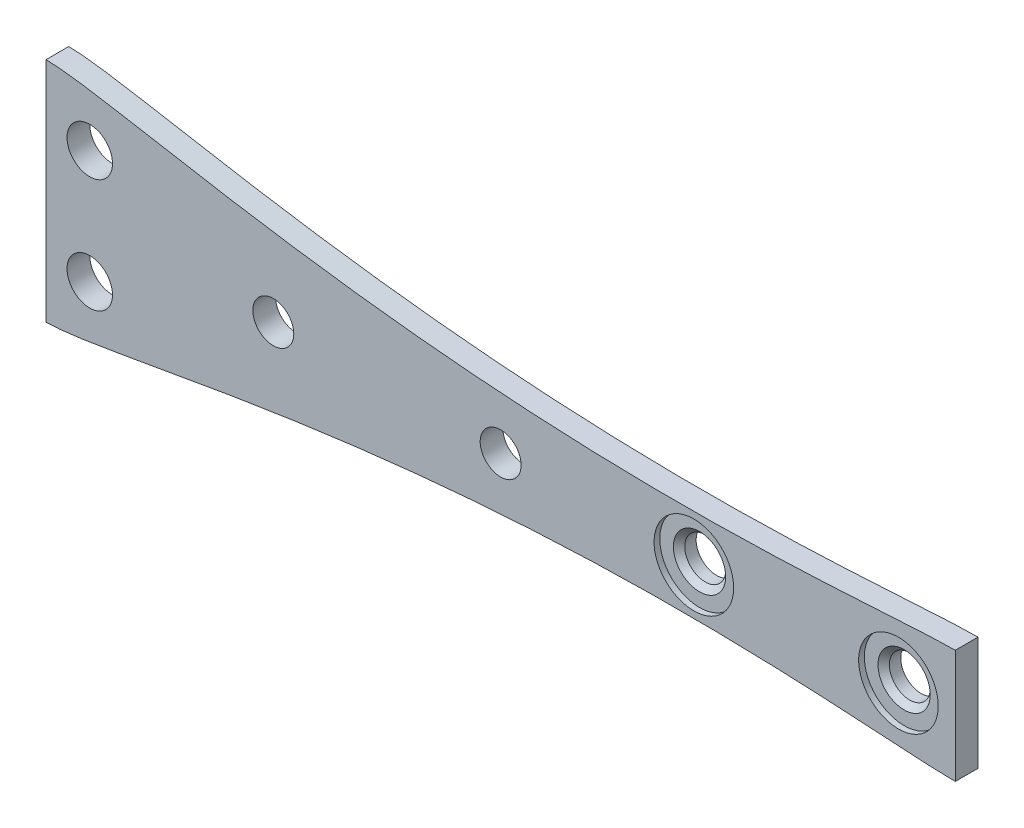
ISO-10303-21;
HEADER;
FILE_DESCRIPTION(('STEP AP214'),'2;1');
FILE_NAME('part.step','',(''),(''),'','','');
FILE_SCHEMA(('AUTOMOTIVE_DESIGN { 1 0 10303 214 1 1 1 1 }'));
ENDSEC;
DATA;
#1=APPLICATION_CONTEXT('core data for automotive mechanical design processes');
#2=APPLICATION_PROTOCOL_DEFINITION('international standard','automotive_design',2000,#1);
#3=PRODUCT_CONTEXT('',#1,'mechanical');
#4=PRODUCT('Part','Part','',(#3));
#5=PRODUCT_RELATED_PRODUCT_CATEGORY('part','',(#4));
#6=PRODUCT_DEFINITION_FORMATION('','',#4);
#7=PRODUCT_DEFINITION_CONTEXT('part definition',#1,'design');
#8=PRODUCT_DEFINITION('design','',#6,#7);
#9=PRODUCT_DEFINITION_SHAPE('','',#8);
#10=(LENGTH_UNIT() NAMED_UNIT(*) SI_UNIT(.MILLI.,.METRE.));
#11=(NAMED_UNIT(*) PLANE_ANGLE_UNIT() SI_UNIT($,.RADIAN.));
#12=(NAMED_UNIT(*) SI_UNIT($,.STERADIAN.) SOLID_ANGLE_UNIT());
#13=UNCERTAINTY_MEASURE_WITH_UNIT(LENGTH_MEASURE(1.E-05),#10,'distance_accuracy_value','');
#14=(GEOMETRIC_REPRESENTATION_CONTEXT(3) GLOBAL_UNCERTAINTY_ASSIGNED_CONTEXT((#13)) GLOBAL_UNIT_ASSIGNED_CONTEXT((#10,
#11,#12)) REPRESENTATION_CONTEXT('',''));
#15=CARTESIAN_POINT('',(0.,0.,0.));
#16=DIRECTION('',(0.,0.,1.));
#17=DIRECTION('',(1.,0.,0.));
#18=AXIS2_PLACEMENT_3D('',#15,#16,#17);
#19=CARTESIAN_POINT('',(57.,10.,2.));
#20=DIRECTION('',(0.,0.,-1.));
#21=DIRECTION('',(-1.,0.,0.));
#22=AXIS2_PLACEMENT_3D('',#19,#20,#21);
#23=CYLINDRICAL_SURFACE('',#22,1.8);
#24=CARTESIAN_POINT('',(57.,10.,0.999999999999977));
#25=DIRECTION('',(0.,0.,1.));
#26=DIRECTION('',(1.,0.,0.));
#27=AXIS2_PLACEMENT_3D('',#24,#25,#26);
#28=CIRCLE('',#27,1.8);
#29=CARTESIAN_POINT('',(58.8,10.,0.999999999999977));
#30=VERTEX_POINT('',#29);
#31=EDGE_CURVE('E58',#30,#30,#28,.T.);
#32=ORIENTED_EDGE('',*,*,#31,.T.);
#33=EDGE_LOOP('',(#32));
#34=FACE_BOUND('',#33,.T.);
#35=CARTESIAN_POINT('',(57.,10.,0.));
#36=DIRECTION('',(0.,0.,1.));
#37=DIRECTION('',(1.,0.,0.));
#38=AXIS2_PLACEMENT_3D('',#35,#36,#37);
#39=CIRCLE('',#38,1.8);
#40=CARTESIAN_POINT('',(58.8,10.,0.));
#41=VERTEX_POINT('',#40);
#42=EDGE_CURVE('E215',#41,#41,#39,.T.);
#43=ORIENTED_EDGE('',*,*,#42,.F.);
#44=EDGE_LOOP('',(#43));
#45=FACE_BOUND('',#44,.T.);
#46=ADVANCED_FACE('F47',(#34,#45),#23,.F.);
#47=CARTESIAN_POINT('',(75.,10.,2.));
#48=DIRECTION('',(0.,0.,-1.));
#49=DIRECTION('',(-1.,0.,0.));
#50=AXIS2_PLACEMENT_3D('',#47,#48,#49);
#51=CYLINDRICAL_SURFACE('',#50,1.79999999999999);
#52=CARTESIAN_POINT('',(75.,10.,0.999999999999998));
#53=DIRECTION('',(0.,0.,1.));
#54=DIRECTION('',(1.,0.,0.));
#55=AXIS2_PLACEMENT_3D('',#52,#53,#54);
#56=CIRCLE('',#55,1.79999999999999);
#57=CARTESIAN_POINT('',(76.8,10.,0.999999999999998));
#58=VERTEX_POINT('',#57);
#59=EDGE_CURVE('E230',#58,#58,#56,.T.);
#60=ORIENTED_EDGE('',*,*,#59,.T.);
#61=EDGE_LOOP('',(#60));
#62=FACE_BOUND('',#61,.T.);
#63=CARTESIAN_POINT('',(75.,10.,0.));
#64=DIRECTION('',(0.,0.,1.));
#65=DIRECTION('',(1.,0.,0.));
#66=AXIS2_PLACEMENT_3D('',#63,#64,#65);
#67=CIRCLE('',#66,1.79999999999999);
#68=CARTESIAN_POINT('',(76.8,10.,0.));
#69=VERTEX_POINT('',#68);
#70=EDGE_CURVE('E219',#69,#69,#67,.T.);
#71=ORIENTED_EDGE('',*,*,#70,.F.);
#72=EDGE_LOOP('',(#71));
#73=FACE_BOUND('',#72,.T.);
#74=ADVANCED_FACE('F147',(#62,#73),#51,.F.);
#75=CARTESIAN_POINT('',(80.,0.,2.));
#76=DIRECTION('',(1.,0.,0.));
#77=DIRECTION('',(0.,0.,-1.));
#78=AXIS2_PLACEMENT_3D('',#75,#76,#77);
#79=PLANE('',#78);
#80=DIRECTION('',(0.,-1.,0.));
#81=VECTOR('',#80,1.);
#82=CARTESIAN_POINT('',(80.,0.,0.));
#83=LINE('',#82,#81);
#84=CARTESIAN_POINT('',(80.,15.,0.));
#85=VERTEX_POINT('',#84);
#86=CARTESIAN_POINT('',(80.,5.00000000000001,0.));
#87=VERTEX_POINT('',#86);
#88=EDGE_CURVE('E300',#85,#87,#83,.T.);
#89=ORIENTED_EDGE('',*,*,#88,.F.);
#90=DIRECTION('',(0.,0.,-1.));
#91=VECTOR('',#90,1.);
#92=CARTESIAN_POINT('',(80.,15.,2.));
#93=LINE('',#92,#91);
#94=CARTESIAN_POINT('',(80.,15.,2.));
#95=VERTEX_POINT('',#94);
#96=EDGE_CURVE('E92',#95,#85,#93,.T.);
#97=ORIENTED_EDGE('',*,*,#96,.F.);
#98=DIRECTION('',(0.,-1.,0.));
#99=VECTOR('',#98,1.);
#100=CARTESIAN_POINT('',(80.,0.,2.));
#101=LINE('',#100,#99);
#102=CARTESIAN_POINT('',(80.,5.00000000000001,2.));
#103=VERTEX_POINT('',#102);
#104=EDGE_CURVE('E112',#95,#103,#101,.T.);
#105=ORIENTED_EDGE('',*,*,#104,.T.);
#106=DIRECTION('',(0.,0.,-1.));
#107=VECTOR('',#106,1.);
#108=CARTESIAN_POINT('',(80.,5.00000000000001,2.));
#109=LINE('',#108,#107);
#110=EDGE_CURVE('E89',#103,#87,#109,.T.);
#111=ORIENTED_EDGE('',*,*,#110,.T.);
#112=EDGE_LOOP('',(#89,#97,#105,#111));
#113=FACE_BOUND('',#112,.T.);
#114=ADVANCED_FACE('F145',(#113),#79,.T.);
#115=CARTESIAN_POINT('',(0.,20.,2.));
#116=CARTESIAN_POINT('',(8.,20.,2.));
#117=CARTESIAN_POINT('',(39.,10.,2.));
#118=CARTESIAN_POINT('',(70.,15.,2.));
#119=CARTESIAN_POINT('',(80.,15.,2.));
#120=B_SPLINE_CURVE_WITH_KNOTS('',4,(#115,#116,#117,#118,#119),.UNSPECIFIED.,.F.,.F.,(5,5),(0.,
1.),.UNSPECIFIED.);
#121=DIRECTION('',(0.,0.,-1.));
#122=VECTOR('',#121,1.);
#123=SURFACE_OF_LINEAR_EXTRUSION('',#120,#122);
#124=CARTESIAN_POINT('',(0.,20.,0.));
#125=CARTESIAN_POINT('',(8.,20.,0.));
#126=CARTESIAN_POINT('',(39.,10.,0.));
#127=CARTESIAN_POINT('',(70.,15.,0.));
#128=CARTESIAN_POINT('',(80.,15.,0.));
#129=B_SPLINE_CURVE_WITH_KNOTS('',4,(#124,#125,#126,#127,#128),.UNSPECIFIED.,.F.,.F.,(5,5),(0.,
1.),.UNSPECIFIED.);
#130=CARTESIAN_POINT('',(0.,20.,0.));
#131=VERTEX_POINT('',#130);
#132=EDGE_CURVE('E102',#131,#85,#129,.T.);
#133=ORIENTED_EDGE('',*,*,#132,.F.);
#134=DIRECTION('',(0.,0.,-1.));
#135=VECTOR('',#134,1.);
#136=CARTESIAN_POINT('',(0.,20.,2.));
#137=LINE('',#136,#135);
#138=CARTESIAN_POINT('',(0.,20.,2.));
#139=VERTEX_POINT('',#138);
#140=EDGE_CURVE('E97',#139,#131,#137,.T.);
#141=ORIENTED_EDGE('',*,*,#140,.F.);
#142=EDGE_CURVE('E100',#139,#95,#120,.T.);
#143=ORIENTED_EDGE('',*,*,#142,.T.);
#144=ORIENTED_EDGE('',*,*,#96,.T.);
#145=EDGE_LOOP('',(#133,#141,#143,#144));
#146=FACE_BOUND('',#145,.T.);
#147=ADVANCED_FACE('F99',(#146),#123,.T.);
#148=CARTESIAN_POINT('',(0.,0.,2.));
#149=DIRECTION('',(-1.,0.,0.));
#150=DIRECTION('',(0.,0.,1.));
#151=AXIS2_PLACEMENT_3D('',#148,#149,#150);
#152=PLANE('',#151);
#153=DIRECTION('',(0.,1.,0.));
#154=VECTOR('',#153,1.);
#155=CARTESIAN_POINT('',(0.,0.,0.));
#156=LINE('',#155,#154);
#157=CARTESIAN_POINT('',(0.,0.,0.));
#158=VERTEX_POINT('',#157);
#159=EDGE_CURVE('E311',#158,#131,#156,.T.);
#160=ORIENTED_EDGE('',*,*,#159,.F.);
#161=DIRECTION('',(0.,0.,-1.));
#162=VECTOR('',#161,1.);
#163=CARTESIAN_POINT('',(0.,0.,2.));
#164=LINE('',#163,#162);
#165=CARTESIAN_POINT('',(0.,0.,2.));
#166=VERTEX_POINT('',#165);
#167=EDGE_CURVE('E82',#166,#158,#164,.T.);
#168=ORIENTED_EDGE('',*,*,#167,.F.);
#169=DIRECTION('',(0.,1.,0.));
#170=VECTOR('',#169,1.);
#171=CARTESIAN_POINT('',(0.,0.,2.));
#172=LINE('',#171,#170);
#173=EDGE_CURVE('E111',#166,#139,#172,.T.);
#174=ORIENTED_EDGE('',*,*,#173,.T.);
#175=ORIENTED_EDGE('',*,*,#140,.T.);
#176=EDGE_LOOP('',(#160,#168,#174,#175));
#177=FACE_BOUND('',#176,.T.);
#178=ADVANCED_FACE('F115',(#177),#152,.T.);
#179=CARTESIAN_POINT('',(20.,10.,2.));
#180=DIRECTION('',(0.,0.,-1.));
#181=DIRECTION('',(-1.,0.,0.));
#182=AXIS2_PLACEMENT_3D('',#179,#180,#181);
#183=CYLINDRICAL_SURFACE('',#182,1.8);
#184=CARTESIAN_POINT('',(20.,10.,2.));
#185=DIRECTION('',(0.,0.,1.));
#186=DIRECTION('',(1.,0.,0.));
#187=AXIS2_PLACEMENT_3D('',#184,#185,#186);
#188=CIRCLE('',#187,1.8);
#189=CARTESIAN_POINT('',(21.8,10.,2.));
#190=VERTEX_POINT('',#189);
#191=EDGE_CURVE('E225',#190,#190,#188,.T.);
#192=ORIENTED_EDGE('',*,*,#191,.T.);
#193=EDGE_LOOP('',(#192));
#194=FACE_BOUND('',#193,.T.);
#195=CARTESIAN_POINT('',(20.,10.,0.));
#196=DIRECTION('',(0.,0.,1.));
#197=DIRECTION('',(1.,0.,0.));
#198=AXIS2_PLACEMENT_3D('',#195,#196,#197);
#199=CIRCLE('',#198,1.8);
#200=CARTESIAN_POINT('',(21.8,10.,0.));
#201=VERTEX_POINT('',#200);
#202=EDGE_CURVE('E205',#201,#201,#199,.T.);
#203=ORIENTED_EDGE('',*,*,#202,.F.);
#204=EDGE_LOOP('',(#203));
#205=FACE_BOUND('',#204,.T.);
#206=ADVANCED_FACE('F142',(#194,#205),#183,.F.);
#207=CARTESIAN_POINT('',(40.,9.99999999999998,2.));
#208=DIRECTION('',(0.,0.,-1.));
#209=DIRECTION('',(-1.,0.,0.));
#210=AXIS2_PLACEMENT_3D('',#207,#208,#209);
#211=CYLINDRICAL_SURFACE('',#210,1.8);
#212=CARTESIAN_POINT('',(40.,9.99999999999998,2.));
#213=DIRECTION('',(0.,0.,1.));
#214=DIRECTION('',(1.,0.,0.));
#215=AXIS2_PLACEMENT_3D('',#212,#213,#214);
#216=CIRCLE('',#215,1.8);
#217=CARTESIAN_POINT('',(41.8,9.99999999999998,2.));
#218=VERTEX_POINT('',#217);
#219=EDGE_CURVE('E243',#218,#218,#216,.T.);
#220=ORIENTED_EDGE('',*,*,#219,.T.);
#221=EDGE_LOOP('',(#220));
#222=FACE_BOUND('',#221,.T.);
#223=CARTESIAN_POINT('',(40.,9.99999999999998,0.));
#224=DIRECTION('',(0.,0.,1.));
#225=DIRECTION('',(1.,0.,0.));
#226=AXIS2_PLACEMENT_3D('',#223,#224,#225);
#227=CIRCLE('',#226,1.8);
#228=CARTESIAN_POINT('',(41.8,9.99999999999998,0.));
#229=VERTEX_POINT('',#228);
#230=EDGE_CURVE('E199',#229,#229,#227,.T.);
#231=ORIENTED_EDGE('',*,*,#230,.F.);
#232=EDGE_LOOP('',(#231));
#233=FACE_BOUND('',#232,.T.);
#234=ADVANCED_FACE('F179',(#222,#233),#211,.F.);
#235=CARTESIAN_POINT('',(3.85,15.,2.));
#236=DIRECTION('',(0.,0.,-1.));
#237=DIRECTION('',(-1.,0.,0.));
#238=AXIS2_PLACEMENT_3D('',#235,#236,#237);
#239=CYLINDRICAL_SURFACE('',#238,2.);
#240=CARTESIAN_POINT('',(3.85,15.,2.));
#241=DIRECTION('',(0.,0.,1.));
#242=DIRECTION('',(1.,0.,0.));
#243=AXIS2_PLACEMENT_3D('',#240,#241,#242);
#244=CIRCLE('',#243,2.);
#245=CARTESIAN_POINT('',(5.85,15.,2.));
#246=VERTEX_POINT('',#245);
#247=EDGE_CURVE('E193',#246,#246,#244,.T.);
#248=ORIENTED_EDGE('',*,*,#247,.T.);
#249=EDGE_LOOP('',(#248));
#250=FACE_BOUND('',#249,.T.);
#251=CARTESIAN_POINT('',(3.85,15.,0.));
#252=DIRECTION('',(0.,0.,1.));
#253=DIRECTION('',(1.,0.,0.));
#254=AXIS2_PLACEMENT_3D('',#251,#252,#253);
#255=CIRCLE('',#254,2.);
#256=CARTESIAN_POINT('',(5.85,15.,0.));
#257=VERTEX_POINT('',#256);
#258=EDGE_CURVE('E196',#257,#257,#255,.T.);
#259=ORIENTED_EDGE('',*,*,#258,.F.);
#260=EDGE_LOOP('',(#259));
#261=FACE_BOUND('',#260,.T.);
#262=ADVANCED_FACE('F182',(#250,#261),#239,.F.);
#263=CARTESIAN_POINT('',(3.85,5.,2.));
#264=DIRECTION('',(0.,0.,-1.));
#265=DIRECTION('',(-1.,0.,0.));
#266=AXIS2_PLACEMENT_3D('',#263,#264,#265);
#267=CYLINDRICAL_SURFACE('',#266,2.);
#268=CARTESIAN_POINT('',(3.85,5.,2.));
#269=DIRECTION('',(0.,0.,1.));
#270=DIRECTION('',(1.,0.,0.));
#271=AXIS2_PLACEMENT_3D('',#268,#269,#270);
#272=CIRCLE('',#271,2.);
#273=CARTESIAN_POINT('',(5.85,5.,2.));
#274=VERTEX_POINT('',#273);
#275=EDGE_CURVE('E119',#274,#274,#272,.T.);
#276=ORIENTED_EDGE('',*,*,#275,.T.);
#277=EDGE_LOOP('',(#276));
#278=FACE_BOUND('',#277,.T.);
#279=CARTESIAN_POINT('',(3.85,5.,0.));
#280=DIRECTION('',(0.,0.,1.));
#281=DIRECTION('',(1.,0.,0.));
#282=AXIS2_PLACEMENT_3D('',#279,#280,#281);
#283=CIRCLE('',#282,2.);
#284=CARTESIAN_POINT('',(5.85,5.,0.));
#285=VERTEX_POINT('',#284);
#286=EDGE_CURVE('E200',#285,#285,#283,.T.);
#287=ORIENTED_EDGE('',*,*,#286,.F.);
#288=EDGE_LOOP('',(#287));
#289=FACE_BOUND('',#288,.T.);
#290=ADVANCED_FACE('F138',(#278,#289),#267,.F.);
#291=CARTESIAN_POINT('',(0.,0.,2.));
#292=CARTESIAN_POINT('',(8.00000000000001,0.,2.));
#293=CARTESIAN_POINT('',(39.,10.,2.));
#294=CARTESIAN_POINT('',(70.,5.00000000000001,2.));
#295=CARTESIAN_POINT('',(80.,5.00000000000001,2.));
#296=B_SPLINE_CURVE_WITH_KNOTS('',4,(#291,#292,#293,#294,#295),.UNSPECIFIED.,.F.,.F.,(5,5),(0.,
1.),.UNSPECIFIED.);
#297=DIRECTION('',(0.,0.,-1.));
#298=VECTOR('',#297,1.);
#299=SURFACE_OF_LINEAR_EXTRUSION('',#296,#298);
#300=CARTESIAN_POINT('',(0.,0.,0.));
#301=CARTESIAN_POINT('',(8.00000000000001,0.,0.));
#302=CARTESIAN_POINT('',(39.,10.,0.));
#303=CARTESIAN_POINT('',(70.,5.00000000000001,0.));
#304=CARTESIAN_POINT('',(80.,5.00000000000001,0.));
#305=B_SPLINE_CURVE_WITH_KNOTS('',4,(#300,#301,#302,#303,#304),.UNSPECIFIED.,.F.,.F.,(5,5),(0.,
1.),.UNSPECIFIED.);
#306=EDGE_CURVE('E208',#158,#87,#305,.T.);
#307=ORIENTED_EDGE('',*,*,#306,.T.);
#308=ORIENTED_EDGE('',*,*,#110,.F.);
#309=EDGE_CURVE('E66',#166,#103,#296,.T.);
#310=ORIENTED_EDGE('',*,*,#309,.F.);
#311=ORIENTED_EDGE('',*,*,#167,.T.);
#312=EDGE_LOOP('',(#307,#308,#310,#311));
#313=FACE_BOUND('',#312,.T.);
#314=ADVANCED_FACE('F134',(#313),#299,.F.);
#315=CARTESIAN_POINT('',(0.,0.,2.));
#316=DIRECTION('',(0.,0.,1.));
#317=DIRECTION('',(1.,0.,0.));
#318=AXIS2_PLACEMENT_3D('',#315,#316,#317);
#319=PLANE('',#318);
#320=CARTESIAN_POINT('',(57.,10.,2.));
#321=DIRECTION('',(0.,0.,1.));
#322=DIRECTION('',(1.,0.,0.));
#323=AXIS2_PLACEMENT_3D('',#320,#321,#322);
#324=CIRCLE('',#323,3.5);
#325=CARTESIAN_POINT('',(60.5,10.,2.));
#326=VERTEX_POINT('',#325);
#327=EDGE_CURVE('E294',#326,#326,#324,.T.);
#328=ORIENTED_EDGE('',*,*,#327,.F.);
#329=EDGE_LOOP('',(#328));
#330=FACE_BOUND('',#329,.T.);
#331=CARTESIAN_POINT('',(75.,10.,2.));
#332=DIRECTION('',(0.,0.,1.));
#333=DIRECTION('',(1.,0.,0.));
#334=AXIS2_PLACEMENT_3D('',#331,#332,#333);
#335=CIRCLE('',#334,3.50000000000001);
#336=CARTESIAN_POINT('',(78.5,10.,2.));
#337=VERTEX_POINT('',#336);
#338=EDGE_CURVE('E296',#337,#337,#335,.T.);
#339=ORIENTED_EDGE('',*,*,#338,.F.);
#340=EDGE_LOOP('',(#339));
#341=FACE_BOUND('',#340,.T.);
#342=ORIENTED_EDGE('',*,*,#104,.F.);
#343=ORIENTED_EDGE('',*,*,#142,.F.);
#344=ORIENTED_EDGE('',*,*,#173,.F.);
#345=ORIENTED_EDGE('',*,*,#309,.T.);
#346=EDGE_LOOP('',(#342,#343,#344,#345));
#347=FACE_BOUND('',#346,.T.);
#348=ORIENTED_EDGE('',*,*,#275,.F.);
#349=EDGE_LOOP('',(#348));
#350=FACE_BOUND('',#349,.T.);
#351=ORIENTED_EDGE('',*,*,#247,.F.);
#352=EDGE_LOOP('',(#351));
#353=FACE_BOUND('',#352,.T.);
#354=ORIENTED_EDGE('',*,*,#219,.F.);
#355=EDGE_LOOP('',(#354));
#356=FACE_BOUND('',#355,.T.);
#357=ORIENTED_EDGE('',*,*,#191,.F.);
#358=EDGE_LOOP('',(#357));
#359=FACE_BOUND('',#358,.T.);
#360=ADVANCED_FACE('F109',(#330,#341,#347,#350,#353,#356,#359),#319,.T.);
#361=CARTESIAN_POINT('',(0.,0.,0.));
#362=DIRECTION('',(0.,0.,1.));
#363=DIRECTION('',(1.,0.,0.));
#364=AXIS2_PLACEMENT_3D('',#361,#362,#363);
#365=PLANE('',#364);
#366=ORIENTED_EDGE('',*,*,#88,.T.);
#367=ORIENTED_EDGE('',*,*,#306,.F.);
#368=ORIENTED_EDGE('',*,*,#159,.T.);
#369=ORIENTED_EDGE('',*,*,#132,.T.);
#370=EDGE_LOOP('',(#366,#367,#368,#369));
#371=FACE_BOUND('',#370,.T.);
#372=ORIENTED_EDGE('',*,*,#286,.T.);
#373=EDGE_LOOP('',(#372));
#374=FACE_BOUND('',#373,.T.);
#375=ORIENTED_EDGE('',*,*,#258,.T.);
#376=EDGE_LOOP('',(#375));
#377=FACE_BOUND('',#376,.T.);
#378=ORIENTED_EDGE('',*,*,#230,.T.);
#379=EDGE_LOOP('',(#378));
#380=FACE_BOUND('',#379,.T.);
#381=ORIENTED_EDGE('',*,*,#202,.T.);
#382=EDGE_LOOP('',(#381));
#383=FACE_BOUND('',#382,.T.);
#384=ORIENTED_EDGE('',*,*,#42,.T.);
#385=EDGE_LOOP('',(#384));
#386=FACE_BOUND('',#385,.T.);
#387=ORIENTED_EDGE('',*,*,#70,.T.);
#388=EDGE_LOOP('',(#387));
#389=FACE_BOUND('',#388,.T.);
#390=ADVANCED_FACE('F254',(#371,#374,#377,#380,#383,#386,#389),#365,.F.);
#391=CARTESIAN_POINT('',(75.,10.,1.5));
#392=DIRECTION('',(0.,0.,1.));
#393=DIRECTION('',(1.,0.,0.));
#394=AXIS2_PLACEMENT_3D('',#391,#392,#393);
#395=CYLINDRICAL_SURFACE('',#394,3.50000000000001);
#396=CARTESIAN_POINT('',(75.,10.,1.5));
#397=DIRECTION('',(0.,0.,1.));
#398=DIRECTION('',(1.,0.,0.));
#399=AXIS2_PLACEMENT_3D('',#396,#397,#398);
#400=CIRCLE('',#399,3.50000000000001);
#401=CARTESIAN_POINT('',(78.5,10.,1.5));
#402=VERTEX_POINT('',#401);
#403=EDGE_CURVE('E303',#402,#402,#400,.T.);
#404=ORIENTED_EDGE('',*,*,#403,.F.);
#405=EDGE_LOOP('',(#404));
#406=FACE_BOUND('',#405,.T.);
#407=ORIENTED_EDGE('',*,*,#338,.T.);
#408=EDGE_LOOP('',(#407));
#409=FACE_BOUND('',#408,.T.);
#410=ADVANCED_FACE('F266',(#406,#409),#395,.F.);
#411=CARTESIAN_POINT('',(75.,10.,1.5));
#412=DIRECTION('',(0.,0.,1.));
#413=DIRECTION('',(1.,0.,0.));
#414=AXIS2_PLACEMENT_3D('',#411,#412,#413);
#415=PLANE('',#414);
#416=CARTESIAN_POINT('',(75.,10.,1.5));
#417=DIRECTION('',(0.,0.,1.));
#418=DIRECTION('',(1.,0.,0.));
#419=AXIS2_PLACEMENT_3D('',#416,#417,#418);
#420=CIRCLE('',#419,2.3);
#421=CARTESIAN_POINT('',(77.3,10.,1.5));
#422=VERTEX_POINT('',#421);
#423=EDGE_CURVE('E234',#422,#422,#420,.F.);
#424=ORIENTED_EDGE('',*,*,#423,.T.);
#425=EDGE_LOOP('',(#424));
#426=FACE_BOUND('',#425,.T.);
#427=ORIENTED_EDGE('',*,*,#403,.T.);
#428=EDGE_LOOP('',(#427));
#429=FACE_BOUND('',#428,.T.);
#430=ADVANCED_FACE('F275',(#426,#429),#415,.T.);
#431=CARTESIAN_POINT('',(57.,10.,1.5));
#432=DIRECTION('',(0.,0.,1.));
#433=DIRECTION('',(1.,0.,0.));
#434=AXIS2_PLACEMENT_3D('',#431,#432,#433);
#435=CYLINDRICAL_SURFACE('',#434,3.5);
#436=CARTESIAN_POINT('',(57.,10.,1.5));
#437=DIRECTION('',(0.,0.,1.));
#438=DIRECTION('',(1.,0.,0.));
#439=AXIS2_PLACEMENT_3D('',#436,#437,#438);
#440=CIRCLE('',#439,3.5);
#441=CARTESIAN_POINT('',(60.5,10.,1.5));
#442=VERTEX_POINT('',#441);
#443=EDGE_CURVE('E291',#442,#442,#440,.T.);
#444=ORIENTED_EDGE('',*,*,#443,.F.);
#445=EDGE_LOOP('',(#444));
#446=FACE_BOUND('',#445,.T.);
#447=ORIENTED_EDGE('',*,*,#327,.T.);
#448=EDGE_LOOP('',(#447));
#449=FACE_BOUND('',#448,.T.);
#450=ADVANCED_FACE('F160',(#446,#449),#435,.F.);
#451=CARTESIAN_POINT('',(57.,10.,1.5));
#452=DIRECTION('',(0.,0.,1.));
#453=DIRECTION('',(1.,0.,0.));
#454=AXIS2_PLACEMENT_3D('',#451,#452,#453);
#455=PLANE('',#454);
#456=CARTESIAN_POINT('',(57.,10.,1.5));
#457=DIRECTION('',(0.,0.,1.));
#458=DIRECTION('',(1.,0.,0.));
#459=AXIS2_PLACEMENT_3D('',#456,#457,#458);
#460=CIRCLE('',#459,2.30000000000002);
#461=CARTESIAN_POINT('',(59.3,10.,1.5));
#462=VERTEX_POINT('',#461);
#463=EDGE_CURVE('E11',#462,#462,#460,.F.);
#464=ORIENTED_EDGE('',*,*,#463,.T.);
#465=EDGE_LOOP('',(#464));
#466=FACE_BOUND('',#465,.T.);
#467=ORIENTED_EDGE('',*,*,#443,.T.);
#468=EDGE_LOOP('',(#467));
#469=FACE_BOUND('',#468,.T.);
#470=ADVANCED_FACE('F153',(#466,#469),#455,.T.);
#471=CARTESIAN_POINT('',(75.,10.,0.999999999999998));
#472=DIRECTION('',(0.,0.,1.));
#473=DIRECTION('',(1.,0.,0.));
#474=AXIS2_PLACEMENT_3D('',#471,#472,#473);
#475=CONICAL_SURFACE('',#474,1.79999999999999,0.785398163397449);
#476=ORIENTED_EDGE('',*,*,#423,.F.);
#477=EDGE_LOOP('',(#476));
#478=FACE_BOUND('',#477,.T.);
#479=ORIENTED_EDGE('',*,*,#59,.F.);
#480=EDGE_LOOP('',(#479));
#481=FACE_BOUND('',#480,.T.);
#482=ADVANCED_FACE('F149',(#478,#481),#475,.F.);
#483=CARTESIAN_POINT('',(57.,10.,0.999999999999977));
#484=DIRECTION('',(0.,0.,1.));
#485=DIRECTION('',(1.,0.,0.));
#486=AXIS2_PLACEMENT_3D('',#483,#484,#485);
#487=CONICAL_SURFACE('',#486,1.8,0.785398163397442);
#488=ORIENTED_EDGE('',*,*,#463,.F.);
#489=EDGE_LOOP('',(#488));
#490=FACE_BOUND('',#489,.T.);
#491=ORIENTED_EDGE('',*,*,#31,.F.);
#492=EDGE_LOOP('',(#491));
#493=FACE_BOUND('',#492,.T.);
#494=ADVANCED_FACE('F50',(#490,#493),#487,.F.);
#495=CLOSED_SHELL('',(#46,#74,#114,#147,#178,#206,#234,#262,#290,#314,#360,#390,#410,#430,#450,
#470,#482,#494));
#496=MANIFOLD_SOLID_BREP('B2',#495);
#497=ADVANCED_BREP_SHAPE_REPRESENTATION('',(#18,#496),#14);
#498=SHAPE_DEFINITION_REPRESENTATION(#9,#497);
ENDSEC;
END-ISO-10303-21;
